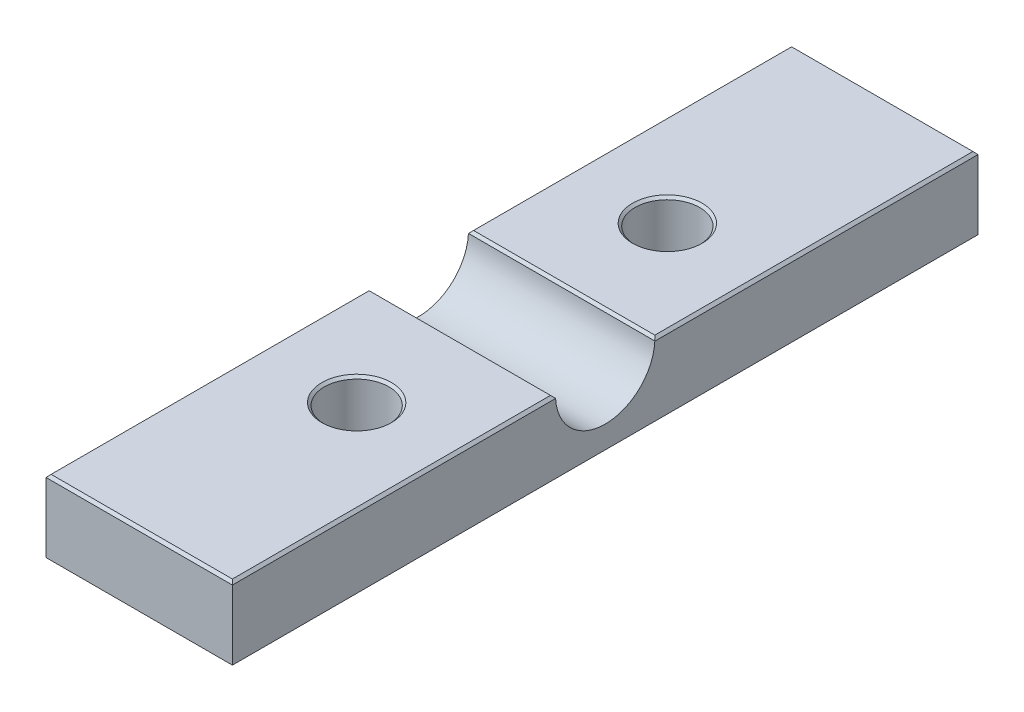
ISO-10303-21;
HEADER;
FILE_DESCRIPTION(('STEP AP214'),'2;1');
FILE_NAME('part.step','',(''),(''),'','','');
FILE_SCHEMA(('AUTOMOTIVE_DESIGN { 1 0 10303 214 1 1 1 1 }'));
ENDSEC;
DATA;
#1=APPLICATION_CONTEXT('core data for automotive mechanical design processes');
#2=APPLICATION_PROTOCOL_DEFINITION('international standard','automotive_design',2000,#1);
#3=PRODUCT_CONTEXT('',#1,'mechanical');
#4=PRODUCT('Part','Part','',(#3));
#5=PRODUCT_RELATED_PRODUCT_CATEGORY('part','',(#4));
#6=PRODUCT_DEFINITION_FORMATION('','',#4);
#7=PRODUCT_DEFINITION_CONTEXT('part definition',#1,'design');
#8=PRODUCT_DEFINITION('design','',#6,#7);
#9=PRODUCT_DEFINITION_SHAPE('','',#8);
#10=(LENGTH_UNIT() NAMED_UNIT(*) SI_UNIT(.MILLI.,.METRE.));
#11=(NAMED_UNIT(*) PLANE_ANGLE_UNIT() SI_UNIT($,.RADIAN.));
#12=(NAMED_UNIT(*) SI_UNIT($,.STERADIAN.) SOLID_ANGLE_UNIT());
#13=UNCERTAINTY_MEASURE_WITH_UNIT(LENGTH_MEASURE(1.E-05),#10,'distance_accuracy_value','');
#14=(GEOMETRIC_REPRESENTATION_CONTEXT(3) GLOBAL_UNCERTAINTY_ASSIGNED_CONTEXT((#13)) GLOBAL_UNIT_ASSIGNED_CONTEXT((#10,
#11,#12)) REPRESENTATION_CONTEXT('',''));
#15=CARTESIAN_POINT('',(0.,0.,0.));
#16=DIRECTION('',(0.,0.,1.));
#17=DIRECTION('',(1.,0.,0.));
#18=AXIS2_PLACEMENT_3D('',#15,#16,#17);
#19=CARTESIAN_POINT('',(0.,6.,0.));
#20=DIRECTION('',(0.,1.,0.));
#21=DIRECTION('',(0.,0.,1.));
#22=AXIS2_PLACEMENT_3D('',#19,#20,#21);
#23=PLANE('',#22);
#24=CARTESIAN_POINT('',(0.,6.,12.5));
#25=DIRECTION('',(0.,1.,0.));
#26=DIRECTION('',(0.,0.,1.));
#27=AXIS2_PLACEMENT_3D('',#24,#25,#26);
#28=CIRCLE('',#27,2.79999999999999);
#29=CARTESIAN_POINT('',(0.,6.,15.3));
#30=VERTEX_POINT('',#29);
#31=EDGE_CURVE('E11',#30,#30,#28,.F.);
#32=ORIENTED_EDGE('',*,*,#31,.T.);
#33=EDGE_LOOP('',(#32));
#34=FACE_BOUND('',#33,.T.);
#35=DIRECTION('',(1.,0.,0.));
#36=VECTOR('',#35,1.);
#37=CARTESIAN_POINT('',(7.5,6.,29.7944587074561));
#38=LINE('',#37,#36);
#39=CARTESIAN_POINT('',(-7.29445870745607,6.,29.7944587074561));
#40=VERTEX_POINT('',#39);
#41=CARTESIAN_POINT('',(7.29445870745607,6.,29.7944587074561));
#42=VERTEX_POINT('',#41);
#43=EDGE_CURVE('E61',#40,#42,#38,.T.);
#44=ORIENTED_EDGE('',*,*,#43,.T.);
#45=DIRECTION('',(0.,0.,-1.));
#46=VECTOR('',#45,1.);
#47=CARTESIAN_POINT('',(7.29445870745607,6.,0.));
#48=LINE('',#47,#46);
#49=CARTESIAN_POINT('',(7.29445870745607,6.,4.2));
#50=VERTEX_POINT('',#49);
#51=EDGE_CURVE('E53',#42,#50,#48,.T.);
#52=ORIENTED_EDGE('',*,*,#51,.T.);
#53=DIRECTION('',(-1.,0.,0.));
#54=VECTOR('',#53,1.);
#55=CARTESIAN_POINT('',(-7.5,6.,4.2));
#56=LINE('',#55,#54);
#57=CARTESIAN_POINT('',(-7.29445870745607,6.,4.2));
#58=VERTEX_POINT('',#57);
#59=EDGE_CURVE('E264',#50,#58,#56,.T.);
#60=ORIENTED_EDGE('',*,*,#59,.T.);
#61=DIRECTION('',(0.,0.,1.));
#62=VECTOR('',#61,1.);
#63=CARTESIAN_POINT('',(-7.29445870745607,6.,30.));
#64=LINE('',#63,#62);
#65=EDGE_CURVE('E66',#58,#40,#64,.T.);
#66=ORIENTED_EDGE('',*,*,#65,.T.);
#67=EDGE_LOOP('',(#44,#52,#60,#66));
#68=FACE_BOUND('',#67,.T.);
#69=ADVANCED_FACE('F42',(#34,#68),#23,.T.);
#70=CARTESIAN_POINT('',(7.5,6.,0.));
#71=DIRECTION('',(1.,0.,0.));
#72=DIRECTION('',(0.,0.,-1.));
#73=AXIS2_PLACEMENT_3D('',#70,#71,#72);
#74=PLANE('',#73);
#75=DIRECTION('',(0.,-1.,0.));
#76=VECTOR('',#75,1.);
#77=CARTESIAN_POINT('',(7.5,6.,30.));
#78=LINE('',#77,#76);
#79=CARTESIAN_POINT('',(7.5,5.78418164282888,30.));
#80=VERTEX_POINT('',#79);
#81=CARTESIAN_POINT('',(7.5,0.199999999999999,30.));
#82=VERTEX_POINT('',#81);
#83=EDGE_CURVE('E383',#80,#82,#78,.T.);
#84=ORIENTED_EDGE('',*,*,#83,.T.);
#85=DIRECTION('',(0.,0.,-1.));
#86=VECTOR('',#85,1.);
#87=CARTESIAN_POINT('',(7.5,0.199999999999999,-30.));
#88=LINE('',#87,#86);
#89=CARTESIAN_POINT('',(7.5,0.199999999999999,-30.));
#90=VERTEX_POINT('',#89);
#91=EDGE_CURVE('E226',#82,#90,#88,.T.);
#92=ORIENTED_EDGE('',*,*,#91,.T.);
#93=DIRECTION('',(0.,-1.,0.));
#94=VECTOR('',#93,1.);
#95=CARTESIAN_POINT('',(7.5,6.,-30.));
#96=LINE('',#95,#94);
#97=CARTESIAN_POINT('',(7.5,5.78418164282888,-30.));
#98=VERTEX_POINT('',#97);
#99=EDGE_CURVE('E376',#98,#90,#96,.T.);
#100=ORIENTED_EDGE('',*,*,#99,.F.);
#101=DIRECTION('',(0.,0.,1.));
#102=VECTOR('',#101,1.);
#103=CARTESIAN_POINT('',(7.5,5.78418164282888,0.));
#104=LINE('',#103,#102);
#105=CARTESIAN_POINT('',(7.5,5.78418164282888,-3.99417356116481));
#106=VERTEX_POINT('',#105);
#107=EDGE_CURVE('E223',#98,#106,#104,.T.);
#108=ORIENTED_EDGE('',*,*,#107,.T.);
#109=CARTESIAN_POINT('',(7.5,6.00000000000001,0.));
#110=DIRECTION('',(1.,0.,0.));
#111=DIRECTION('',(0.,0.,-1.));
#112=AXIS2_PLACEMENT_3D('',#109,#110,#111);
#113=CIRCLE('',#112,4.);
#114=CARTESIAN_POINT('',(7.5,5.78418164282888,3.99417356116481));
#115=VERTEX_POINT('',#114);
#116=EDGE_CURVE('E281',#115,#106,#113,.T.);
#117=ORIENTED_EDGE('',*,*,#116,.F.);
#118=DIRECTION('',(0.,0.,1.));
#119=VECTOR('',#118,1.);
#120=CARTESIAN_POINT('',(7.5,5.78418164282888,0.));
#121=LINE('',#120,#119);
#122=EDGE_CURVE('E219',#115,#80,#121,.T.);
#123=ORIENTED_EDGE('',*,*,#122,.T.);
#124=EDGE_LOOP('',(#84,#92,#100,#108,#117,#123));
#125=FACE_BOUND('',#124,.T.);
#126=ADVANCED_FACE('F323',(#125),#74,.T.);
#127=CARTESIAN_POINT('',(0.,6.,-30.));
#128=DIRECTION('',(0.,0.,-1.));
#129=DIRECTION('',(-1.,0.,0.));
#130=AXIS2_PLACEMENT_3D('',#127,#128,#129);
#131=PLANE('',#130);
#132=ORIENTED_EDGE('',*,*,#99,.T.);
#133=DIRECTION('',(-1.,0.,0.));
#134=VECTOR('',#133,1.);
#135=CARTESIAN_POINT('',(-7.5,0.199999999999999,-30.));
#136=LINE('',#135,#134);
#137=CARTESIAN_POINT('',(-7.5,0.199999999999999,-30.));
#138=VERTEX_POINT('',#137);
#139=EDGE_CURVE('E154',#90,#138,#136,.T.);
#140=ORIENTED_EDGE('',*,*,#139,.T.);
#141=DIRECTION('',(0.,-1.,0.));
#142=VECTOR('',#141,1.);
#143=CARTESIAN_POINT('',(-7.5,6.,-30.));
#144=LINE('',#143,#142);
#145=CARTESIAN_POINT('',(-7.5,5.78418164282888,-30.));
#146=VERTEX_POINT('',#145);
#147=EDGE_CURVE('E392',#146,#138,#144,.T.);
#148=ORIENTED_EDGE('',*,*,#147,.F.);
#149=DIRECTION('',(1.,0.,0.));
#150=VECTOR('',#149,1.);
#151=CARTESIAN_POINT('',(0.,5.78418164282888,-30.));
#152=LINE('',#151,#150);
#153=EDGE_CURVE('E198',#146,#98,#152,.T.);
#154=ORIENTED_EDGE('',*,*,#153,.T.);
#155=EDGE_LOOP('',(#132,#140,#148,#154));
#156=FACE_BOUND('',#155,.T.);
#157=ADVANCED_FACE('F330',(#156),#131,.T.);
#158=CARTESIAN_POINT('',(-7.5,6.,0.));
#159=DIRECTION('',(1.,0.,0.));
#160=DIRECTION('',(0.,0.,-1.));
#161=AXIS2_PLACEMENT_3D('',#158,#159,#160);
#162=PLANE('',#161);
#163=ORIENTED_EDGE('',*,*,#147,.T.);
#164=DIRECTION('',(0.,0.,1.));
#165=VECTOR('',#164,1.);
#166=CARTESIAN_POINT('',(-7.5,0.199999999999999,0.));
#167=LINE('',#166,#165);
#168=CARTESIAN_POINT('',(-7.5,0.199999999999999,30.));
#169=VERTEX_POINT('',#168);
#170=EDGE_CURVE('E210',#138,#169,#167,.T.);
#171=ORIENTED_EDGE('',*,*,#170,.T.);
#172=DIRECTION('',(0.,-1.,0.));
#173=VECTOR('',#172,1.);
#174=CARTESIAN_POINT('',(-7.5,6.,30.));
#175=LINE('',#174,#173);
#176=CARTESIAN_POINT('',(-7.5,5.78418164282888,30.));
#177=VERTEX_POINT('',#176);
#178=EDGE_CURVE('E388',#177,#169,#175,.T.);
#179=ORIENTED_EDGE('',*,*,#178,.F.);
#180=DIRECTION('',(0.,0.,-1.));
#181=VECTOR('',#180,1.);
#182=CARTESIAN_POINT('',(-7.5,5.78418164282888,4.));
#183=LINE('',#182,#181);
#184=CARTESIAN_POINT('',(-7.5,5.78418164282888,3.9941735611648));
#185=VERTEX_POINT('',#184);
#186=EDGE_CURVE('E203',#177,#185,#183,.T.);
#187=ORIENTED_EDGE('',*,*,#186,.T.);
#188=CARTESIAN_POINT('',(-7.5,6.00000000000001,0.));
#189=DIRECTION('',(1.,0.,0.));
#190=DIRECTION('',(0.,0.,-1.));
#191=AXIS2_PLACEMENT_3D('',#188,#189,#190);
#192=CIRCLE('',#191,4.);
#193=CARTESIAN_POINT('',(-7.5,5.78418164282888,-3.99417356116481));
#194=VERTEX_POINT('',#193);
#195=EDGE_CURVE('E379',#194,#185,#192,.F.);
#196=ORIENTED_EDGE('',*,*,#195,.F.);
#197=DIRECTION('',(0.,0.,-1.));
#198=VECTOR('',#197,1.);
#199=CARTESIAN_POINT('',(-7.5,5.78418164282888,-30.));
#200=LINE('',#199,#198);
#201=EDGE_CURVE('E206',#194,#146,#200,.T.);
#202=ORIENTED_EDGE('',*,*,#201,.T.);
#203=EDGE_LOOP('',(#163,#171,#179,#187,#196,#202));
#204=FACE_BOUND('',#203,.T.);
#205=ADVANCED_FACE('F416',(#204),#162,.F.);
#206=CARTESIAN_POINT('',(0.,6.,-12.5));
#207=DIRECTION('',(0.,-1.,0.));
#208=DIRECTION('',(0.,0.,-1.));
#209=AXIS2_PLACEMENT_3D('',#206,#207,#208);
#210=CYLINDRICAL_SURFACE('',#209,2.6);
#211=CARTESIAN_POINT('',(0.,0.199999999999999,-12.5));
#212=DIRECTION('',(0.,1.,0.));
#213=DIRECTION('',(0.,0.,1.));
#214=AXIS2_PLACEMENT_3D('',#211,#212,#213);
#215=CIRCLE('',#214,2.6);
#216=CARTESIAN_POINT('',(0.,0.199999999999999,-9.90000000000001));
#217=VERTEX_POINT('',#216);
#218=EDGE_CURVE('E194',#217,#217,#215,.F.);
#219=ORIENTED_EDGE('',*,*,#218,.T.);
#220=EDGE_LOOP('',(#219));
#221=FACE_BOUND('',#220,.T.);
#222=CARTESIAN_POINT('',(0.,5.80000000000001,-12.5));
#223=DIRECTION('',(0.,1.,0.));
#224=DIRECTION('',(0.,0.,1.));
#225=AXIS2_PLACEMENT_3D('',#222,#223,#224);
#226=CIRCLE('',#225,2.6);
#227=CARTESIAN_POINT('',(0.,5.80000000000001,-9.90000000000001));
#228=VERTEX_POINT('',#227);
#229=EDGE_CURVE('E190',#228,#228,#226,.T.);
#230=ORIENTED_EDGE('',*,*,#229,.T.);
#231=EDGE_LOOP('',(#230));
#232=FACE_BOUND('',#231,.T.);
#233=ADVANCED_FACE('F421',(#221,#232),#210,.F.);
#234=CARTESIAN_POINT('',(0.,6.,30.));
#235=DIRECTION('',(0.,0.,-1.));
#236=DIRECTION('',(-1.,0.,0.));
#237=AXIS2_PLACEMENT_3D('',#234,#235,#236);
#238=PLANE('',#237);
#239=ORIENTED_EDGE('',*,*,#178,.T.);
#240=DIRECTION('',(1.,0.,0.));
#241=VECTOR('',#240,1.);
#242=CARTESIAN_POINT('',(0.,0.199999999999999,30.));
#243=LINE('',#242,#241);
#244=EDGE_CURVE('E216',#169,#82,#243,.T.);
#245=ORIENTED_EDGE('',*,*,#244,.T.);
#246=ORIENTED_EDGE('',*,*,#83,.F.);
#247=DIRECTION('',(-1.,0.,0.));
#248=VECTOR('',#247,1.);
#249=CARTESIAN_POINT('',(-7.5,5.78418164282888,30.));
#250=LINE('',#249,#248);
#251=EDGE_CURVE('E213',#80,#177,#250,.T.);
#252=ORIENTED_EDGE('',*,*,#251,.T.);
#253=EDGE_LOOP('',(#239,#245,#246,#252));
#254=FACE_BOUND('',#253,.T.);
#255=ADVANCED_FACE('F344',(#254),#238,.F.);
#256=CARTESIAN_POINT('',(0.,6.,12.5));
#257=DIRECTION('',(0.,-1.,0.));
#258=DIRECTION('',(0.,0.,-1.));
#259=AXIS2_PLACEMENT_3D('',#256,#257,#258);
#260=CYLINDRICAL_SURFACE('',#259,2.6);
#261=CARTESIAN_POINT('',(0.,0.200000000000006,12.5));
#262=DIRECTION('',(0.,1.,0.));
#263=DIRECTION('',(0.,0.,1.));
#264=AXIS2_PLACEMENT_3D('',#261,#262,#263);
#265=CIRCLE('',#264,2.6);
#266=CARTESIAN_POINT('',(0.,0.200000000000006,15.1));
#267=VERTEX_POINT('',#266);
#268=EDGE_CURVE('E170',#267,#267,#265,.F.);
#269=ORIENTED_EDGE('',*,*,#268,.T.);
#270=EDGE_LOOP('',(#269));
#271=FACE_BOUND('',#270,.T.);
#272=CARTESIAN_POINT('',(0.,5.80000000000001,12.5));
#273=DIRECTION('',(0.,1.,0.));
#274=DIRECTION('',(0.,0.,1.));
#275=AXIS2_PLACEMENT_3D('',#272,#273,#274);
#276=CIRCLE('',#275,2.6);
#277=CARTESIAN_POINT('',(0.,5.80000000000001,15.1));
#278=VERTEX_POINT('',#277);
#279=EDGE_CURVE('E398',#278,#278,#276,.T.);
#280=ORIENTED_EDGE('',*,*,#279,.T.);
#281=EDGE_LOOP('',(#280));
#282=FACE_BOUND('',#281,.T.);
#283=ADVANCED_FACE('F336',(#271,#282),#260,.F.);
#284=CARTESIAN_POINT('',(0.,6.,-12.5));
#285=DIRECTION('',(0.,1.,0.));
#286=DIRECTION('',(0.,0.,1.));
#287=AXIS2_PLACEMENT_3D('',#284,#285,#286);
#288=CIRCLE('',#287,2.79999999999999);
#289=CARTESIAN_POINT('',(0.,6.,-9.70000000000002));
#290=VERTEX_POINT('',#289);
#291=EDGE_CURVE('E242',#290,#290,#288,.F.);
#292=ORIENTED_EDGE('',*,*,#291,.T.);
#293=EDGE_LOOP('',(#292));
#294=FACE_BOUND('',#293,.T.);
#295=DIRECTION('',(-1.,0.,0.));
#296=VECTOR('',#295,1.);
#297=CARTESIAN_POINT('',(0.,6.,-29.7944587074561));
#298=LINE('',#297,#296);
#299=CARTESIAN_POINT('',(7.29445870745607,6.,-29.7944587074561));
#300=VERTEX_POINT('',#299);
#301=CARTESIAN_POINT('',(-7.29445870745607,6.,-29.7944587074561));
#302=VERTEX_POINT('',#301);
#303=EDGE_CURVE('E235',#300,#302,#298,.T.);
#304=ORIENTED_EDGE('',*,*,#303,.T.);
#305=DIRECTION('',(0.,0.,1.));
#306=VECTOR('',#305,1.);
#307=CARTESIAN_POINT('',(-7.29445870745607,6.,-4.));
#308=LINE('',#307,#306);
#309=CARTESIAN_POINT('',(-7.29445870745607,6.,-4.20000000000001));
#310=VERTEX_POINT('',#309);
#311=EDGE_CURVE('E238',#302,#310,#308,.T.);
#312=ORIENTED_EDGE('',*,*,#311,.T.);
#313=DIRECTION('',(1.,0.,0.));
#314=VECTOR('',#313,1.);
#315=CARTESIAN_POINT('',(7.5,6.,-4.2));
#316=LINE('',#315,#314);
#317=CARTESIAN_POINT('',(7.29445870745607,6.,-4.2));
#318=VERTEX_POINT('',#317);
#319=EDGE_CURVE('E229',#310,#318,#316,.T.);
#320=ORIENTED_EDGE('',*,*,#319,.T.);
#321=DIRECTION('',(0.,0.,-1.));
#322=VECTOR('',#321,1.);
#323=CARTESIAN_POINT('',(7.29445870745607,6.,0.));
#324=LINE('',#323,#322);
#325=EDGE_CURVE('E232',#318,#300,#324,.T.);
#326=ORIENTED_EDGE('',*,*,#325,.T.);
#327=EDGE_LOOP('',(#304,#312,#320,#326));
#328=FACE_BOUND('',#327,.T.);
#329=ADVANCED_FACE('F326',(#294,#328),#23,.T.);
#330=CARTESIAN_POINT('',(0.,0.,0.));
#331=DIRECTION('',(0.,1.,0.));
#332=DIRECTION('',(0.,0.,1.));
#333=AXIS2_PLACEMENT_3D('',#330,#331,#332);
#334=PLANE('',#333);
#335=CARTESIAN_POINT('',(0.,0.,12.5));
#336=DIRECTION('',(0.,1.,0.));
#337=DIRECTION('',(0.,0.,1.));
#338=AXIS2_PLACEMENT_3D('',#335,#336,#337);
#339=CIRCLE('',#338,2.8);
#340=CARTESIAN_POINT('',(0.,0.,15.3));
#341=VERTEX_POINT('',#340);
#342=EDGE_CURVE('E182',#341,#341,#339,.T.);
#343=ORIENTED_EDGE('',*,*,#342,.T.);
#344=EDGE_LOOP('',(#343));
#345=FACE_BOUND('',#344,.T.);
#346=CARTESIAN_POINT('',(0.,0.,-12.5));
#347=DIRECTION('',(0.,1.,0.));
#348=DIRECTION('',(0.,0.,1.));
#349=AXIS2_PLACEMENT_3D('',#346,#347,#348);
#350=CIRCLE('',#349,2.8);
#351=CARTESIAN_POINT('',(0.,0.,-9.70000000000001));
#352=VERTEX_POINT('',#351);
#353=EDGE_CURVE('E177',#352,#352,#350,.T.);
#354=ORIENTED_EDGE('',*,*,#353,.T.);
#355=EDGE_LOOP('',(#354));
#356=FACE_BOUND('',#355,.T.);
#357=DIRECTION('',(0.,0.,-1.));
#358=VECTOR('',#357,1.);
#359=CARTESIAN_POINT('',(-7.3,0.,0.));
#360=LINE('',#359,#358);
#361=CARTESIAN_POINT('',(-7.3,0.,29.8));
#362=VERTEX_POINT('',#361);
#363=CARTESIAN_POINT('',(-7.3,0.,-29.8));
#364=VERTEX_POINT('',#363);
#365=EDGE_CURVE('E174',#362,#364,#360,.T.);
#366=ORIENTED_EDGE('',*,*,#365,.T.);
#367=DIRECTION('',(1.,0.,0.));
#368=VECTOR('',#367,1.);
#369=CARTESIAN_POINT('',(7.5,0.,-29.8));
#370=LINE('',#369,#368);
#371=CARTESIAN_POINT('',(7.3,0.,-29.8));
#372=VERTEX_POINT('',#371);
#373=EDGE_CURVE('E152',#364,#372,#370,.T.);
#374=ORIENTED_EDGE('',*,*,#373,.T.);
#375=DIRECTION('',(0.,0.,1.));
#376=VECTOR('',#375,1.);
#377=CARTESIAN_POINT('',(7.3,0.,30.));
#378=LINE('',#377,#376);
#379=CARTESIAN_POINT('',(7.3,0.,29.8));
#380=VERTEX_POINT('',#379);
#381=EDGE_CURVE('E162',#372,#380,#378,.T.);
#382=ORIENTED_EDGE('',*,*,#381,.T.);
#383=DIRECTION('',(-1.,0.,0.));
#384=VECTOR('',#383,1.);
#385=CARTESIAN_POINT('',(0.,0.,29.8));
#386=LINE('',#385,#384);
#387=EDGE_CURVE('E169',#380,#362,#386,.T.);
#388=ORIENTED_EDGE('',*,*,#387,.T.);
#389=EDGE_LOOP('',(#366,#374,#382,#388));
#390=FACE_BOUND('',#389,.T.);
#391=ADVANCED_FACE('F172',(#345,#356,#390),#334,.F.);
#392=CARTESIAN_POINT('',(-7.50100000000001,6.00000000000001,0.));
#393=DIRECTION('',(1.,0.,0.));
#394=DIRECTION('',(0.,0.,-1.));
#395=AXIS2_PLACEMENT_3D('',#392,#393,#394);
#396=CYLINDRICAL_SURFACE('',#395,4.);
#397=DIRECTION('',(1.,0.,0.));
#398=VECTOR('',#397,1.);
#399=CARTESIAN_POINT('',(-7.501,5.79472953214964,-3.99472953214964));
#400=LINE('',#399,#398);
#401=CARTESIAN_POINT('',(7.48995439112308,5.79472953214964,-3.99472953214964));
#402=VERTEX_POINT('',#401);
#403=CARTESIAN_POINT('',(-7.48995439112308,5.79472953214964,-3.99472953214964));
#404=VERTEX_POINT('',#403);
#405=EDGE_CURVE('E255',#402,#404,#400,.F.);
#406=ORIENTED_EDGE('',*,*,#405,.T.);
#407=CARTESIAN_POINT('',(-7.29445870745606,6.00000000000001,0.));
#408=DIRECTION('',(-0.724137931034478,0.689655172413798,0.));
#409=DIRECTION('',(0.689655172413798,0.724137931034478,0.));
#410=AXIS2_PLACEMENT_3D('',#407,#408,#409);
#411=ELLIPSE('',#410,5.52380952380956,4.);
#412=EDGE_CURVE('E261',#404,#194,#411,.T.);
#413=ORIENTED_EDGE('',*,*,#412,.T.);
#414=ORIENTED_EDGE('',*,*,#195,.T.);
#415=CARTESIAN_POINT('',(-7.29445870745606,6.00000000000001,0.));
#416=DIRECTION('',(-0.724137931034479,0.689655172413798,0.));
#417=DIRECTION('',(0.689655172413798,0.724137931034479,0.));
#418=AXIS2_PLACEMENT_3D('',#415,#416,#417);
#419=ELLIPSE('',#418,5.52380952380956,4.);
#420=CARTESIAN_POINT('',(-7.48995439112308,5.79472953214964,3.99472953214964));
#421=VERTEX_POINT('',#420);
#422=EDGE_CURVE('E249',#185,#421,#419,.T.);
#423=ORIENTED_EDGE('',*,*,#422,.T.);
#424=DIRECTION('',(1.,0.,0.));
#425=VECTOR('',#424,1.);
#426=CARTESIAN_POINT('',(-7.50100000000001,5.79472953214964,3.99472953214964));
#427=LINE('',#426,#425);
#428=CARTESIAN_POINT('',(7.48995439112308,5.79472953214964,3.99472953214964));
#429=VERTEX_POINT('',#428);
#430=EDGE_CURVE('E246',#421,#429,#427,.T.);
#431=ORIENTED_EDGE('',*,*,#430,.T.);
#432=CARTESIAN_POINT('',(7.29445870745607,6.00000000000001,0.));
#433=DIRECTION('',(-0.724137931034479,-0.689655172413798,0.));
#434=DIRECTION('',(0.689655172413798,-0.724137931034479,0.));
#435=AXIS2_PLACEMENT_3D('',#432,#433,#434);
#436=ELLIPSE('',#435,5.52380952380956,4.);
#437=EDGE_CURVE('E252',#429,#115,#436,.F.);
#438=ORIENTED_EDGE('',*,*,#437,.T.);
#439=ORIENTED_EDGE('',*,*,#116,.T.);
#440=CARTESIAN_POINT('',(7.29445870745606,6.00000000000001,0.));
#441=DIRECTION('',(-0.724137931034478,-0.689655172413798,0.));
#442=DIRECTION('',(0.689655172413798,-0.724137931034478,0.));
#443=AXIS2_PLACEMENT_3D('',#440,#441,#442);
#444=ELLIPSE('',#443,5.52380952380956,4.);
#445=EDGE_CURVE('E258',#106,#402,#444,.F.);
#446=ORIENTED_EDGE('',*,*,#445,.T.);
#447=EDGE_LOOP('',(#406,#413,#414,#423,#431,#438,#439,#446));
#448=FACE_BOUND('',#447,.T.);
#449=ADVANCED_FACE('F342',(#448),#396,.F.);
#450=CARTESIAN_POINT('',(0.,0.200000000000006,12.5));
#451=DIRECTION('',(0.,-1.,0.));
#452=DIRECTION('',(0.,0.,-1.));
#453=AXIS2_PLACEMENT_3D('',#450,#451,#452);
#454=CONICAL_SURFACE('',#453,2.6,0.785398163397444);
#455=ORIENTED_EDGE('',*,*,#342,.F.);
#456=EDGE_LOOP('',(#455));
#457=FACE_BOUND('',#456,.T.);
#458=ORIENTED_EDGE('',*,*,#268,.F.);
#459=EDGE_LOOP('',(#458));
#460=FACE_BOUND('',#459,.T.);
#461=ADVANCED_FACE('F434',(#457,#460),#454,.F.);
#462=CARTESIAN_POINT('',(0.,0.,-12.5));
#463=DIRECTION('',(0.,-1.,0.));
#464=DIRECTION('',(0.,0.,-1.));
#465=AXIS2_PLACEMENT_3D('',#462,#463,#464);
#466=CONICAL_SURFACE('',#465,2.8,0.785398163397444);
#467=ORIENTED_EDGE('',*,*,#218,.F.);
#468=EDGE_LOOP('',(#467));
#469=FACE_BOUND('',#468,.T.);
#470=ORIENTED_EDGE('',*,*,#353,.F.);
#471=EDGE_LOOP('',(#470));
#472=FACE_BOUND('',#471,.T.);
#473=ADVANCED_FACE('F440',(#469,#472),#466,.F.);
#474=CARTESIAN_POINT('',(0.,0.199999999999999,30.));
#475=DIRECTION('',(0.,0.707106781186548,-0.707106781186548));
#476=DIRECTION('',(1.,0.,0.));
#477=AXIS2_PLACEMENT_3D('',#474,#475,#476);
#478=PLANE('',#477);
#479=DIRECTION('',(0.577350269189626,0.577350269189626,0.577350269189626));
#480=VECTOR('',#479,1.);
#481=CARTESIAN_POINT('',(-2.63333333333334,-9.93333333333333,19.8666666666667));
#482=LINE('',#481,#480);
#483=EDGE_CURVE('E165',#82,#380,#482,.F.);
#484=ORIENTED_EDGE('',*,*,#483,.F.);
#485=ORIENTED_EDGE('',*,*,#244,.F.);
#486=DIRECTION('',(0.577350269189626,-0.577350269189626,-0.577350269189626));
#487=VECTOR('',#486,1.);
#488=CARTESIAN_POINT('',(-5.,-2.3,27.5));
#489=LINE('',#488,#487);
#490=EDGE_CURVE('E277',#362,#169,#489,.F.);
#491=ORIENTED_EDGE('',*,*,#490,.F.);
#492=ORIENTED_EDGE('',*,*,#387,.F.);
#493=EDGE_LOOP('',(#484,#485,#491,#492));
#494=FACE_BOUND('',#493,.T.);
#495=ADVANCED_FACE('F408',(#494),#478,.F.);
#496=CARTESIAN_POINT('',(-7.5,0.199999999999999,0.));
#497=DIRECTION('',(0.707106781186548,0.707106781186548,0.));
#498=DIRECTION('',(0.,0.,1.));
#499=AXIS2_PLACEMENT_3D('',#496,#497,#498);
#500=PLANE('',#499);
#501=ORIENTED_EDGE('',*,*,#490,.T.);
#502=ORIENTED_EDGE('',*,*,#170,.F.);
#503=DIRECTION('',(-0.577350269189626,0.577350269189626,-0.577350269189626));
#504=VECTOR('',#503,1.);
#505=CARTESIAN_POINT('',(2.5,-9.8,-20.));
#506=LINE('',#505,#504);
#507=EDGE_CURVE('E158',#364,#138,#506,.T.);
#508=ORIENTED_EDGE('',*,*,#507,.F.);
#509=ORIENTED_EDGE('',*,*,#365,.F.);
#510=EDGE_LOOP('',(#501,#502,#508,#509));
#511=FACE_BOUND('',#510,.T.);
#512=ADVANCED_FACE('F411',(#511),#500,.F.);
#513=CARTESIAN_POINT('',(7.3,0.,0.));
#514=DIRECTION('',(0.707106781186548,-0.707106781186548,0.));
#515=DIRECTION('',(0.,0.,-1.));
#516=AXIS2_PLACEMENT_3D('',#513,#514,#515);
#517=PLANE('',#516);
#518=ORIENTED_EDGE('',*,*,#483,.T.);
#519=ORIENTED_EDGE('',*,*,#381,.F.);
#520=DIRECTION('',(0.577350269189626,0.577350269189626,-0.577350269189626));
#521=VECTOR('',#520,1.);
#522=CARTESIAN_POINT('',(-2.63333333333333,-9.93333333333333,-19.8666666666667));
#523=LINE('',#522,#521);
#524=EDGE_CURVE('E148',#90,#372,#523,.F.);
#525=ORIENTED_EDGE('',*,*,#524,.F.);
#526=ORIENTED_EDGE('',*,*,#91,.F.);
#527=EDGE_LOOP('',(#518,#519,#525,#526));
#528=FACE_BOUND('',#527,.T.);
#529=ADVANCED_FACE('F163',(#528),#517,.T.);
#530=CARTESIAN_POINT('',(0.,0.,-29.8));
#531=DIRECTION('',(0.,-0.707106781186548,-0.707106781186548));
#532=DIRECTION('',(-1.,0.,0.));
#533=AXIS2_PLACEMENT_3D('',#530,#531,#532);
#534=PLANE('',#533);
#535=ORIENTED_EDGE('',*,*,#507,.T.);
#536=ORIENTED_EDGE('',*,*,#139,.F.);
#537=ORIENTED_EDGE('',*,*,#524,.T.);
#538=ORIENTED_EDGE('',*,*,#373,.F.);
#539=EDGE_LOOP('',(#535,#536,#537,#538));
#540=FACE_BOUND('',#539,.T.);
#541=ADVANCED_FACE('F150',(#540),#534,.T.);
#542=CARTESIAN_POINT('',(0.,5.80000000000001,-12.5));
#543=DIRECTION('',(0.,1.,0.));
#544=DIRECTION('',(0.,0.,1.));
#545=AXIS2_PLACEMENT_3D('',#542,#543,#544);
#546=CONICAL_SURFACE('',#545,2.6,0.785398163397448);
#547=ORIENTED_EDGE('',*,*,#291,.F.);
#548=EDGE_LOOP('',(#547));
#549=FACE_BOUND('',#548,.T.);
#550=ORIENTED_EDGE('',*,*,#229,.F.);
#551=EDGE_LOOP('',(#550));
#552=FACE_BOUND('',#551,.T.);
#553=ADVANCED_FACE('F455',(#549,#552),#546,.F.);
#554=CARTESIAN_POINT('',(7.5,5.78418164282888,0.));
#555=DIRECTION('',(-0.724137931034478,-0.689655172413798,0.));
#556=DIRECTION('',(0.,0.,1.));
#557=AXIS2_PLACEMENT_3D('',#554,#555,#556);
#558=PLANE('',#557);
#559=ORIENTED_EDGE('',*,*,#445,.F.);
#560=ORIENTED_EDGE('',*,*,#107,.F.);
#561=DIRECTION('',(-0.567732955803663,0.596119603593838,0.567732955803661));
#562=VECTOR('',#561,1.);
#563=CARTESIAN_POINT('',(-2.16962127316687,15.937283979654,-20.3303787268332));
#564=LINE('',#563,#562);
#565=EDGE_CURVE('E159',#300,#98,#564,.F.);
#566=ORIENTED_EDGE('',*,*,#565,.F.);
#567=ORIENTED_EDGE('',*,*,#325,.F.);
#568=DIRECTION('',(-0.558580773477947,0.586509812151837,-0.586509812151847));
#569=VECTOR('',#568,1.);
#570=CARTESIAN_POINT('',(2.67809093601889,10.847186160009,-9.04718616000906));
#571=LINE('',#570,#569);
#572=EDGE_CURVE('E288',#402,#318,#571,.T.);
#573=ORIENTED_EDGE('',*,*,#572,.F.);
#574=EDGE_LOOP('',(#559,#560,#566,#567,#573));
#575=FACE_BOUND('',#574,.T.);
#576=ADVANCED_FACE('F369',(#575),#558,.F.);
#577=CARTESIAN_POINT('',(0.,5.78418164282888,-30.));
#578=DIRECTION('',(0.,-0.689655172413796,0.72413793103448));
#579=DIRECTION('',(1.,0.,0.));
#580=AXIS2_PLACEMENT_3D('',#577,#578,#579);
#581=PLANE('',#580);
#582=ORIENTED_EDGE('',*,*,#565,.T.);
#583=ORIENTED_EDGE('',*,*,#153,.F.);
#584=DIRECTION('',(-0.567732955803663,-0.596119603593838,-0.567732955803661));
#585=VECTOR('',#584,1.);
#586=CARTESIAN_POINT('',(-5.08259468170827,8.32245722703516,-27.5825946817083));
#587=LINE('',#586,#585);
#588=EDGE_CURVE('E285',#302,#146,#587,.T.);
#589=ORIENTED_EDGE('',*,*,#588,.F.);
#590=ORIENTED_EDGE('',*,*,#303,.F.);
#591=EDGE_LOOP('',(#582,#583,#589,#590));
#592=FACE_BOUND('',#591,.T.);
#593=ADVANCED_FACE('F356',(#592),#581,.F.);
#594=CARTESIAN_POINT('',(-7.501,6.,-4.20000000000001));
#595=DIRECTION('',(0.,-0.707106781186554,-0.707106781186542));
#596=DIRECTION('',(1.,0.,0.));
#597=AXIS2_PLACEMENT_3D('',#594,#595,#596);
#598=PLANE('',#597);
#599=ORIENTED_EDGE('',*,*,#572,.T.);
#600=ORIENTED_EDGE('',*,*,#319,.F.);
#601=DIRECTION('',(0.558580773477947,0.586509812151837,-0.586509812151847));
#602=VECTOR('',#601,1.);
#603=CARTESIAN_POINT('',(-7.35890216846822,5.93233436593724,-4.13233436593725));
#604=LINE('',#603,#602);
#605=EDGE_CURVE('E282',#404,#310,#604,.T.);
#606=ORIENTED_EDGE('',*,*,#605,.F.);
#607=ORIENTED_EDGE('',*,*,#405,.F.);
#608=EDGE_LOOP('',(#599,#600,#606,#607));
#609=FACE_BOUND('',#608,.T.);
#610=ADVANCED_FACE('F365',(#609),#598,.F.);
#611=CARTESIAN_POINT('',(-7.29445870745607,6.,0.));
#612=DIRECTION('',(-0.724137931034478,0.689655172413798,0.));
#613=DIRECTION('',(0.,0.,-1.));
#614=AXIS2_PLACEMENT_3D('',#611,#612,#613);
#615=PLANE('',#614);
#616=ORIENTED_EDGE('',*,*,#588,.T.);
#617=ORIENTED_EDGE('',*,*,#201,.F.);
#618=ORIENTED_EDGE('',*,*,#412,.F.);
#619=ORIENTED_EDGE('',*,*,#605,.T.);
#620=ORIENTED_EDGE('',*,*,#311,.F.);
#621=EDGE_LOOP('',(#616,#617,#618,#619,#620));
#622=FACE_BOUND('',#621,.T.);
#623=ADVANCED_FACE('F359',(#622),#615,.T.);
#624=CARTESIAN_POINT('',(0.,6.,12.5));
#625=DIRECTION('',(0.,1.,0.));
#626=DIRECTION('',(0.,0.,1.));
#627=AXIS2_PLACEMENT_3D('',#624,#625,#626);
#628=CONICAL_SURFACE('',#627,2.79999999999999,0.785398163397461);
#629=ORIENTED_EDGE('',*,*,#279,.F.);
#630=EDGE_LOOP('',(#629));
#631=FACE_BOUND('',#630,.T.);
#632=ORIENTED_EDGE('',*,*,#31,.F.);
#633=EDGE_LOOP('',(#632));
#634=FACE_BOUND('',#633,.T.);
#635=ADVANCED_FACE('F482',(#631,#634),#628,.F.);
#636=CARTESIAN_POINT('',(-7.29445870745607,6.,0.));
#637=DIRECTION('',(-0.724137931034479,0.689655172413798,0.));
#638=DIRECTION('',(0.,0.,-1.));
#639=AXIS2_PLACEMENT_3D('',#636,#637,#638);
#640=PLANE('',#639);
#641=DIRECTION('',(0.567732955803664,0.596119603593839,-0.567732955803659));
#642=VECTOR('',#641,1.);
#643=CARTESIAN_POINT('',(2.30891235054755,16.0835396109037,20.1910876494525));
#644=LINE('',#643,#642);
#645=EDGE_CURVE('E300',#40,#177,#644,.F.);
#646=ORIENTED_EDGE('',*,*,#645,.F.);
#647=ORIENTED_EDGE('',*,*,#65,.F.);
#648=DIRECTION('',(0.558580773477947,0.586509812151837,0.586509812151847));
#649=VECTOR('',#648,1.);
#650=CARTESIAN_POINT('',(-7.35890216846822,5.93233436593724,4.13233436593724));
#651=LINE('',#650,#649);
#652=EDGE_CURVE('E47',#421,#58,#651,.T.);
#653=ORIENTED_EDGE('',*,*,#652,.F.);
#654=ORIENTED_EDGE('',*,*,#422,.F.);
#655=ORIENTED_EDGE('',*,*,#186,.F.);
#656=EDGE_LOOP('',(#646,#647,#653,#654,#655));
#657=FACE_BOUND('',#656,.T.);
#658=ADVANCED_FACE('F45',(#657),#640,.T.);
#659=CARTESIAN_POINT('',(-7.50100000000001,6.,4.2));
#660=DIRECTION('',(0.,0.707106781186554,-0.707106781186542));
#661=DIRECTION('',(1.,0.,0.));
#662=AXIS2_PLACEMENT_3D('',#659,#660,#661);
#663=PLANE('',#662);
#664=ORIENTED_EDGE('',*,*,#652,.T.);
#665=ORIENTED_EDGE('',*,*,#59,.F.);
#666=DIRECTION('',(-0.558580773477947,0.586509812151837,0.586509812151847));
#667=VECTOR('',#666,1.);
#668=CARTESIAN_POINT('',(2.67809093601889,10.847186160009,9.04718616000906));
#669=LINE('',#668,#667);
#670=EDGE_CURVE('E298',#429,#50,#669,.T.);
#671=ORIENTED_EDGE('',*,*,#670,.F.);
#672=ORIENTED_EDGE('',*,*,#430,.F.);
#673=EDGE_LOOP('',(#664,#665,#671,#672));
#674=FACE_BOUND('',#673,.T.);
#675=ADVANCED_FACE('F311',(#674),#663,.T.);
#676=CARTESIAN_POINT('',(0.,6.,29.7944587074561));
#677=DIRECTION('',(0.,0.689655172413794,0.724137931034481));
#678=DIRECTION('',(-1.,0.,0.));
#679=AXIS2_PLACEMENT_3D('',#676,#677,#678);
#680=PLANE('',#679);
#681=ORIENTED_EDGE('',*,*,#645,.T.);
#682=ORIENTED_EDGE('',*,*,#251,.F.);
#683=DIRECTION('',(0.567732955803664,-0.596119603593839,0.567732955803659));
#684=VECTOR('',#683,1.);
#685=CARTESIAN_POINT('',(4.94330360432757,8.46871285828489,27.4433036043276));
#686=LINE('',#685,#684);
#687=EDGE_CURVE('E295',#42,#80,#686,.T.);
#688=ORIENTED_EDGE('',*,*,#687,.F.);
#689=ORIENTED_EDGE('',*,*,#43,.F.);
#690=EDGE_LOOP('',(#681,#682,#688,#689));
#691=FACE_BOUND('',#690,.T.);
#692=ADVANCED_FACE('F317',(#691),#680,.T.);
#693=CARTESIAN_POINT('',(7.5,5.78418164282888,0.));
#694=DIRECTION('',(-0.724137931034479,-0.689655172413798,0.));
#695=DIRECTION('',(0.,0.,1.));
#696=AXIS2_PLACEMENT_3D('',#693,#694,#695);
#697=PLANE('',#696);
#698=ORIENTED_EDGE('',*,*,#670,.T.);
#699=ORIENTED_EDGE('',*,*,#51,.F.);
#700=ORIENTED_EDGE('',*,*,#687,.T.);
#701=ORIENTED_EDGE('',*,*,#122,.F.);
#702=ORIENTED_EDGE('',*,*,#437,.F.);
#703=EDGE_LOOP('',(#698,#699,#700,#701,#702));
#704=FACE_BOUND('',#703,.T.);
#705=ADVANCED_FACE('F320',(#704),#697,.F.);
#706=CLOSED_SHELL('',(#69,#126,#157,#205,#233,#255,#283,#329,#391,#449,#461,#473,#495,#512,#529,
#541,#553,#576,#593,#610,#623,#635,#658,#675,#692,#705));
#707=MANIFOLD_SOLID_BREP('B2',#706);
#708=ADVANCED_BREP_SHAPE_REPRESENTATION('',(#18,#707),#14);
#709=SHAPE_DEFINITION_REPRESENTATION(#9,#708);
ENDSEC;
END-ISO-10303-21;
